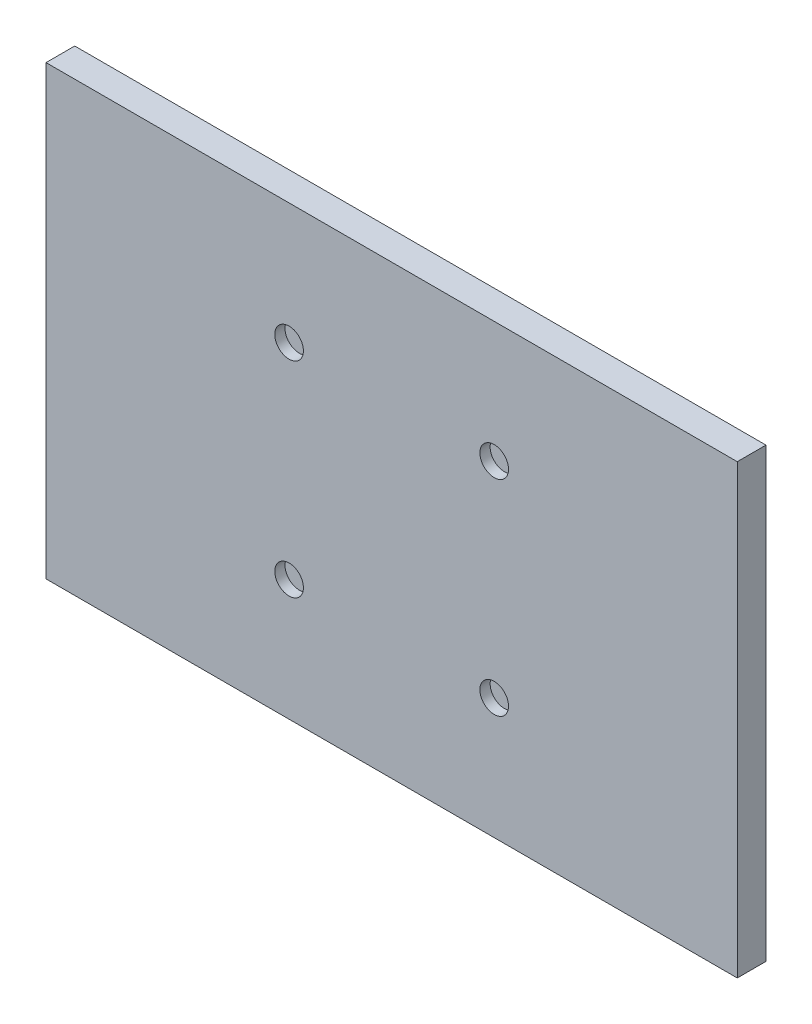
ISO-10303-21;
HEADER;
FILE_DESCRIPTION(('STEP AP214'),'2;1');
FILE_NAME('part.step','',(''),(''),'','','');
FILE_SCHEMA(('AUTOMOTIVE_DESIGN { 1 0 10303 214 1 1 1 1 }'));
ENDSEC;
DATA;
#1=APPLICATION_CONTEXT('core data for automotive mechanical design processes');
#2=APPLICATION_PROTOCOL_DEFINITION('international standard','automotive_design',2000,#1);
#3=PRODUCT_CONTEXT('',#1,'mechanical');
#4=PRODUCT('Part','Part','',(#3));
#5=PRODUCT_RELATED_PRODUCT_CATEGORY('part','',(#4));
#6=PRODUCT_DEFINITION_FORMATION('','',#4);
#7=PRODUCT_DEFINITION_CONTEXT('part definition',#1,'design');
#8=PRODUCT_DEFINITION('design','',#6,#7);
#9=PRODUCT_DEFINITION_SHAPE('','',#8);
#10=(LENGTH_UNIT() NAMED_UNIT(*) SI_UNIT(.MILLI.,.METRE.));
#11=(NAMED_UNIT(*) PLANE_ANGLE_UNIT() SI_UNIT($,.RADIAN.));
#12=(NAMED_UNIT(*) SI_UNIT($,.STERADIAN.) SOLID_ANGLE_UNIT());
#13=UNCERTAINTY_MEASURE_WITH_UNIT(LENGTH_MEASURE(1.E-05),#10,'distance_accuracy_value','');
#14=(GEOMETRIC_REPRESENTATION_CONTEXT(3) GLOBAL_UNCERTAINTY_ASSIGNED_CONTEXT((#13)) GLOBAL_UNIT_ASSIGNED_CONTEXT((#10,
#11,#12)) REPRESENTATION_CONTEXT('',''));
#15=CARTESIAN_POINT('',(0.,0.,0.));
#16=DIRECTION('',(0.,0.,1.));
#17=DIRECTION('',(1.,0.,0.));
#18=AXIS2_PLACEMENT_3D('',#15,#16,#17);
#19=CARTESIAN_POINT('',(84.25,-38.7195,7.));
#20=DIRECTION('',(0.,-1.,0.));
#21=DIRECTION('',(0.,0.,-1.));
#22=AXIS2_PLACEMENT_3D('',#19,#20,#21);
#23=PLANE('',#22);
#24=DIRECTION('',(-1.,0.,0.));
#25=VECTOR('',#24,1.);
#26=CARTESIAN_POINT('',(84.25,-38.7195,0.));
#27=LINE('',#26,#25);
#28=CARTESIAN_POINT('',(84.25,-38.7195,0.));
#29=VERTEX_POINT('',#28);
#30=CARTESIAN_POINT('',(-84.25,-38.7195,0.));
#31=VERTEX_POINT('',#30);
#32=EDGE_CURVE('E117',#29,#31,#27,.T.);
#33=ORIENTED_EDGE('',*,*,#32,.F.);
#34=DIRECTION('',(0.,0.,-1.));
#35=VECTOR('',#34,1.);
#36=CARTESIAN_POINT('',(84.25,-38.7195,7.));
#37=LINE('',#36,#35);
#38=CARTESIAN_POINT('',(84.25,-38.7195,7.));
#39=VERTEX_POINT('',#38);
#40=EDGE_CURVE('E11',#39,#29,#37,.T.);
#41=ORIENTED_EDGE('',*,*,#40,.F.);
#42=DIRECTION('',(-1.,0.,0.));
#43=VECTOR('',#42,1.);
#44=CARTESIAN_POINT('',(84.25,-38.7195,7.));
#45=LINE('',#44,#43);
#46=CARTESIAN_POINT('',(-84.25,-38.7195,7.));
#47=VERTEX_POINT('',#46);
#48=EDGE_CURVE('E109',#39,#47,#45,.T.);
#49=ORIENTED_EDGE('',*,*,#48,.T.);
#50=DIRECTION('',(0.,0.,-1.));
#51=VECTOR('',#50,1.);
#52=CARTESIAN_POINT('',(-84.25,-38.7195,7.));
#53=LINE('',#52,#51);
#54=EDGE_CURVE('E48',#47,#31,#53,.T.);
#55=ORIENTED_EDGE('',*,*,#54,.T.);
#56=EDGE_LOOP('',(#33,#41,#49,#55));
#57=FACE_BOUND('',#56,.T.);
#58=ADVANCED_FACE('F45',(#57),#23,.T.);
#59=CARTESIAN_POINT('',(84.25,-38.7195,7.));
#60=DIRECTION('',(-1.,0.,0.));
#61=DIRECTION('',(0.,-1.,0.));
#62=AXIS2_PLACEMENT_3D('',#59,#60,#61);
#63=PLANE('',#62);
#64=DIRECTION('',(0.,1.,0.));
#65=VECTOR('',#64,1.);
#66=CARTESIAN_POINT('',(84.25,-38.7195,0.));
#67=LINE('',#66,#65);
#68=CARTESIAN_POINT('',(84.25,70.2805,0.));
#69=VERTEX_POINT('',#68);
#70=EDGE_CURVE('E79',#29,#69,#67,.T.);
#71=ORIENTED_EDGE('',*,*,#70,.T.);
#72=DIRECTION('',(0.,0.,-1.));
#73=VECTOR('',#72,1.);
#74=CARTESIAN_POINT('',(84.25,70.2805,7.));
#75=LINE('',#74,#73);
#76=CARTESIAN_POINT('',(84.25,70.2805,7.));
#77=VERTEX_POINT('',#76);
#78=EDGE_CURVE('E55',#77,#69,#75,.T.);
#79=ORIENTED_EDGE('',*,*,#78,.F.);
#80=DIRECTION('',(0.,1.,0.));
#81=VECTOR('',#80,1.);
#82=CARTESIAN_POINT('',(84.25,-38.7195,7.));
#83=LINE('',#82,#81);
#84=EDGE_CURVE('E96',#39,#77,#83,.T.);
#85=ORIENTED_EDGE('',*,*,#84,.F.);
#86=ORIENTED_EDGE('',*,*,#40,.T.);
#87=EDGE_LOOP('',(#71,#79,#85,#86));
#88=FACE_BOUND('',#87,.T.);
#89=ADVANCED_FACE('F134',(#88),#63,.F.);
#90=CARTESIAN_POINT('',(84.25,70.2805,7.));
#91=DIRECTION('',(0.,-1.,0.));
#92=DIRECTION('',(0.,0.,-1.));
#93=AXIS2_PLACEMENT_3D('',#90,#91,#92);
#94=PLANE('',#93);
#95=DIRECTION('',(-1.,0.,0.));
#96=VECTOR('',#95,1.);
#97=CARTESIAN_POINT('',(84.25,70.2805,0.));
#98=LINE('',#97,#96);
#99=CARTESIAN_POINT('',(-84.25,70.2805,0.));
#100=VERTEX_POINT('',#99);
#101=EDGE_CURVE('E104',#69,#100,#98,.T.);
#102=ORIENTED_EDGE('',*,*,#101,.T.);
#103=DIRECTION('',(0.,0.,-1.));
#104=VECTOR('',#103,1.);
#105=CARTESIAN_POINT('',(-84.25,70.2805,7.));
#106=LINE('',#105,#104);
#107=CARTESIAN_POINT('',(-84.25,70.2805,7.));
#108=VERTEX_POINT('',#107);
#109=EDGE_CURVE('E101',#108,#100,#106,.T.);
#110=ORIENTED_EDGE('',*,*,#109,.F.);
#111=DIRECTION('',(-1.,0.,0.));
#112=VECTOR('',#111,1.);
#113=CARTESIAN_POINT('',(84.25,70.2805,7.));
#114=LINE('',#113,#112);
#115=EDGE_CURVE('E91',#77,#108,#114,.T.);
#116=ORIENTED_EDGE('',*,*,#115,.F.);
#117=ORIENTED_EDGE('',*,*,#78,.T.);
#118=EDGE_LOOP('',(#102,#110,#116,#117));
#119=FACE_BOUND('',#118,.T.);
#120=ADVANCED_FACE('F102',(#119),#94,.F.);
#121=CARTESIAN_POINT('',(-84.25,-38.7195,7.));
#122=DIRECTION('',(-1.,0.,0.));
#123=DIRECTION('',(0.,0.,1.));
#124=AXIS2_PLACEMENT_3D('',#121,#122,#123);
#125=PLANE('',#124);
#126=DIRECTION('',(0.,1.,0.));
#127=VECTOR('',#126,1.);
#128=CARTESIAN_POINT('',(-84.25,-38.7195,0.));
#129=LINE('',#128,#127);
#130=EDGE_CURVE('E121',#31,#100,#129,.T.);
#131=ORIENTED_EDGE('',*,*,#130,.F.);
#132=ORIENTED_EDGE('',*,*,#54,.F.);
#133=DIRECTION('',(0.,1.,0.));
#134=VECTOR('',#133,1.);
#135=CARTESIAN_POINT('',(-84.25,-38.7195,7.));
#136=LINE('',#135,#134);
#137=EDGE_CURVE('E95',#47,#108,#136,.T.);
#138=ORIENTED_EDGE('',*,*,#137,.T.);
#139=ORIENTED_EDGE('',*,*,#109,.T.);
#140=EDGE_LOOP('',(#131,#132,#138,#139));
#141=FACE_BOUND('',#140,.T.);
#142=ADVANCED_FACE('F107',(#141),#125,.T.);
#143=CARTESIAN_POINT('',(0.,0.,7.));
#144=DIRECTION('',(0.,0.,-1.));
#145=DIRECTION('',(-1.,0.,0.));
#146=AXIS2_PLACEMENT_3D('',#143,#144,#145);
#147=PLANE('',#146);
#148=CARTESIAN_POINT('',(25.0000000000005,-9.21950000000001,7.));
#149=DIRECTION('',(0.,0.,1.));
#150=DIRECTION('',(1.,0.,0.));
#151=AXIS2_PLACEMENT_3D('',#148,#149,#150);
#152=CIRCLE('',#151,3.49342964426664);
#153=CARTESIAN_POINT('',(28.4934296442672,-9.21950000000001,7.));
#154=VERTEX_POINT('',#153);
#155=EDGE_CURVE('E274',#154,#154,#152,.T.);
#156=ORIENTED_EDGE('',*,*,#155,.F.);
#157=EDGE_LOOP('',(#156));
#158=FACE_BOUND('',#157,.T.);
#159=CARTESIAN_POINT('',(-24.9999999999995,-9.21950000000035,7.));
#160=DIRECTION('',(0.,0.,1.));
#161=DIRECTION('',(1.,0.,0.));
#162=AXIS2_PLACEMENT_3D('',#159,#160,#161);
#163=CIRCLE('',#162,3.49342964426664);
#164=CARTESIAN_POINT('',(-21.5065703557328,-9.21950000000035,7.));
#165=VERTEX_POINT('',#164);
#166=EDGE_CURVE('E266',#165,#165,#163,.T.);
#167=ORIENTED_EDGE('',*,*,#166,.F.);
#168=EDGE_LOOP('',(#167));
#169=FACE_BOUND('',#168,.T.);
#170=CARTESIAN_POINT('',(-25.,40.7804999999996,7.));
#171=DIRECTION('',(0.,0.,1.));
#172=DIRECTION('',(1.,0.,0.));
#173=AXIS2_PLACEMENT_3D('',#170,#171,#172);
#174=CIRCLE('',#173,3.49342964426664);
#175=CARTESIAN_POINT('',(-21.5065703557334,40.7804999999996,7.));
#176=VERTEX_POINT('',#175);
#177=EDGE_CURVE('E257',#176,#176,#174,.T.);
#178=ORIENTED_EDGE('',*,*,#177,.F.);
#179=EDGE_LOOP('',(#178));
#180=FACE_BOUND('',#179,.T.);
#181=CARTESIAN_POINT('',(25.,40.7805,7.));
#182=DIRECTION('',(0.,0.,1.));
#183=DIRECTION('',(1.,0.,0.));
#184=AXIS2_PLACEMENT_3D('',#181,#182,#183);
#185=CIRCLE('',#184,3.49342964426664);
#186=CARTESIAN_POINT('',(28.4934296442666,40.7805,7.));
#187=VERTEX_POINT('',#186);
#188=EDGE_CURVE('E261',#187,#187,#185,.T.);
#189=ORIENTED_EDGE('',*,*,#188,.F.);
#190=EDGE_LOOP('',(#189));
#191=FACE_BOUND('',#190,.T.);
#192=ORIENTED_EDGE('',*,*,#48,.F.);
#193=ORIENTED_EDGE('',*,*,#84,.T.);
#194=ORIENTED_EDGE('',*,*,#115,.T.);
#195=ORIENTED_EDGE('',*,*,#137,.F.);
#196=EDGE_LOOP('',(#192,#193,#194,#195));
#197=FACE_BOUND('',#196,.T.);
#198=ADVANCED_FACE('F94',(#158,#169,#180,#191,#197),#147,.F.);
#199=CARTESIAN_POINT('',(0.,0.,0.));
#200=DIRECTION('',(0.,0.,-1.));
#201=DIRECTION('',(-1.,0.,0.));
#202=AXIS2_PLACEMENT_3D('',#199,#200,#201);
#203=PLANE('',#202);
#204=CARTESIAN_POINT('',(25.0000000000005,-9.21950000000001,0.));
#205=DIRECTION('',(0.,0.,1.));
#206=DIRECTION('',(1.,0.,0.));
#207=AXIS2_PLACEMENT_3D('',#204,#205,#206);
#208=CIRCLE('',#207,3.49342964426664);
#209=CARTESIAN_POINT('',(28.4934296442672,-9.21950000000001,0.));
#210=VERTEX_POINT('',#209);
#211=EDGE_CURVE('E249',#210,#210,#208,.T.);
#212=ORIENTED_EDGE('',*,*,#211,.T.);
#213=EDGE_LOOP('',(#212));
#214=FACE_BOUND('',#213,.T.);
#215=CARTESIAN_POINT('',(-24.9999999999995,-9.21950000000035,0.));
#216=DIRECTION('',(0.,0.,1.));
#217=DIRECTION('',(1.,0.,0.));
#218=AXIS2_PLACEMENT_3D('',#215,#216,#217);
#219=CIRCLE('',#218,3.49342964426664);
#220=CARTESIAN_POINT('',(-21.5065703557328,-9.21950000000035,0.));
#221=VERTEX_POINT('',#220);
#222=EDGE_CURVE('E241',#221,#221,#219,.T.);
#223=ORIENTED_EDGE('',*,*,#222,.T.);
#224=EDGE_LOOP('',(#223));
#225=FACE_BOUND('',#224,.T.);
#226=CARTESIAN_POINT('',(-25.,40.7804999999996,0.));
#227=DIRECTION('',(0.,0.,1.));
#228=DIRECTION('',(1.,0.,0.));
#229=AXIS2_PLACEMENT_3D('',#226,#227,#228);
#230=CIRCLE('',#229,3.49342964426664);
#231=CARTESIAN_POINT('',(-21.5065703557334,40.7804999999996,0.));
#232=VERTEX_POINT('',#231);
#233=EDGE_CURVE('E227',#232,#232,#230,.T.);
#234=ORIENTED_EDGE('',*,*,#233,.T.);
#235=EDGE_LOOP('',(#234));
#236=FACE_BOUND('',#235,.T.);
#237=CARTESIAN_POINT('',(25.,40.7805,0.));
#238=DIRECTION('',(0.,0.,1.));
#239=DIRECTION('',(1.,0.,0.));
#240=AXIS2_PLACEMENT_3D('',#237,#238,#239);
#241=CIRCLE('',#240,3.49342964426664);
#242=CARTESIAN_POINT('',(28.4934296442666,40.7805,0.));
#243=VERTEX_POINT('',#242);
#244=EDGE_CURVE('E226',#243,#243,#241,.T.);
#245=ORIENTED_EDGE('',*,*,#244,.T.);
#246=EDGE_LOOP('',(#245));
#247=FACE_BOUND('',#246,.T.);
#248=ORIENTED_EDGE('',*,*,#32,.T.);
#249=ORIENTED_EDGE('',*,*,#130,.T.);
#250=ORIENTED_EDGE('',*,*,#101,.F.);
#251=ORIENTED_EDGE('',*,*,#70,.F.);
#252=EDGE_LOOP('',(#248,#249,#250,#251));
#253=FACE_BOUND('',#252,.T.);
#254=ADVANCED_FACE('F131',(#214,#225,#236,#247,#253),#203,.T.);
#255=CARTESIAN_POINT('',(25.,40.7805,4.5));
#256=DIRECTION('',(0.,0.,1.));
#257=DIRECTION('',(1.,0.,0.));
#258=AXIS2_PLACEMENT_3D('',#255,#256,#257);
#259=CYLINDRICAL_SURFACE('',#258,3.49342964426664);
#260=CARTESIAN_POINT('',(25.,40.7805,4.5));
#261=DIRECTION('',(0.,0.,1.));
#262=DIRECTION('',(1.,0.,0.));
#263=AXIS2_PLACEMENT_3D('',#260,#261,#262);
#264=CIRCLE('',#263,3.49342964426664);
#265=CARTESIAN_POINT('',(28.4934296442666,40.7805,4.5));
#266=VERTEX_POINT('',#265);
#267=EDGE_CURVE('E122',#266,#266,#264,.T.);
#268=ORIENTED_EDGE('',*,*,#267,.F.);
#269=EDGE_LOOP('',(#268));
#270=FACE_BOUND('',#269,.T.);
#271=ORIENTED_EDGE('',*,*,#188,.T.);
#272=EDGE_LOOP('',(#271));
#273=FACE_BOUND('',#272,.T.);
#274=ADVANCED_FACE('F154',(#270,#273),#259,.F.);
#275=CARTESIAN_POINT('',(25.,40.7805,4.5));
#276=DIRECTION('',(0.,0.,1.));
#277=DIRECTION('',(1.,0.,0.));
#278=AXIS2_PLACEMENT_3D('',#275,#276,#277);
#279=PLANE('',#278);
#280=ORIENTED_EDGE('',*,*,#267,.T.);
#281=EDGE_LOOP('',(#280));
#282=FACE_BOUND('',#281,.T.);
#283=ADVANCED_FACE('F160',(#282),#279,.T.);
#284=CARTESIAN_POINT('',(-25.,40.7804999999996,4.5));
#285=DIRECTION('',(0.,0.,1.));
#286=DIRECTION('',(1.,0.,0.));
#287=AXIS2_PLACEMENT_3D('',#284,#285,#286);
#288=CYLINDRICAL_SURFACE('',#287,3.49342964426664);
#289=CARTESIAN_POINT('',(-25.,40.7804999999996,4.5));
#290=DIRECTION('',(0.,0.,1.));
#291=DIRECTION('',(1.,0.,0.));
#292=AXIS2_PLACEMENT_3D('',#289,#290,#291);
#293=CIRCLE('',#292,3.49342964426664);
#294=CARTESIAN_POINT('',(-21.5065703557334,40.7804999999996,4.5));
#295=VERTEX_POINT('',#294);
#296=EDGE_CURVE('E262',#295,#295,#293,.T.);
#297=ORIENTED_EDGE('',*,*,#296,.F.);
#298=EDGE_LOOP('',(#297));
#299=FACE_BOUND('',#298,.T.);
#300=ORIENTED_EDGE('',*,*,#177,.T.);
#301=EDGE_LOOP('',(#300));
#302=FACE_BOUND('',#301,.T.);
#303=ADVANCED_FACE('F164',(#299,#302),#288,.F.);
#304=CARTESIAN_POINT('',(-25.,40.7804999999996,4.5));
#305=DIRECTION('',(0.,0.,1.));
#306=DIRECTION('',(1.,0.,0.));
#307=AXIS2_PLACEMENT_3D('',#304,#305,#306);
#308=PLANE('',#307);
#309=ORIENTED_EDGE('',*,*,#296,.T.);
#310=EDGE_LOOP('',(#309));
#311=FACE_BOUND('',#310,.T.);
#312=ADVANCED_FACE('F182',(#311),#308,.T.);
#313=CARTESIAN_POINT('',(-24.9999999999995,-9.21950000000035,4.5));
#314=DIRECTION('',(0.,0.,1.));
#315=DIRECTION('',(1.,0.,0.));
#316=AXIS2_PLACEMENT_3D('',#313,#314,#315);
#317=CYLINDRICAL_SURFACE('',#316,3.49342964426664);
#318=CARTESIAN_POINT('',(-24.9999999999995,-9.21950000000035,4.5));
#319=DIRECTION('',(0.,0.,1.));
#320=DIRECTION('',(1.,0.,0.));
#321=AXIS2_PLACEMENT_3D('',#318,#319,#320);
#322=CIRCLE('',#321,3.49342964426664);
#323=CARTESIAN_POINT('',(-21.5065703557328,-9.21950000000035,4.5));
#324=VERTEX_POINT('',#323);
#325=EDGE_CURVE('E270',#324,#324,#322,.T.);
#326=ORIENTED_EDGE('',*,*,#325,.F.);
#327=EDGE_LOOP('',(#326));
#328=FACE_BOUND('',#327,.T.);
#329=ORIENTED_EDGE('',*,*,#166,.T.);
#330=EDGE_LOOP('',(#329));
#331=FACE_BOUND('',#330,.T.);
#332=ADVANCED_FACE('F178',(#328,#331),#317,.F.);
#333=CARTESIAN_POINT('',(-24.9999999999995,-9.21950000000035,4.5));
#334=DIRECTION('',(0.,0.,1.));
#335=DIRECTION('',(1.,0.,0.));
#336=AXIS2_PLACEMENT_3D('',#333,#334,#335);
#337=PLANE('',#336);
#338=ORIENTED_EDGE('',*,*,#325,.T.);
#339=EDGE_LOOP('',(#338));
#340=FACE_BOUND('',#339,.T.);
#341=ADVANCED_FACE('F174',(#340),#337,.T.);
#342=CARTESIAN_POINT('',(25.0000000000005,-9.21950000000001,4.5));
#343=DIRECTION('',(0.,0.,1.));
#344=DIRECTION('',(1.,0.,0.));
#345=AXIS2_PLACEMENT_3D('',#342,#343,#344);
#346=CYLINDRICAL_SURFACE('',#345,3.49342964426664);
#347=CARTESIAN_POINT('',(25.0000000000005,-9.21950000000001,4.5));
#348=DIRECTION('',(0.,0.,1.));
#349=DIRECTION('',(1.,0.,0.));
#350=AXIS2_PLACEMENT_3D('',#347,#348,#349);
#351=CIRCLE('',#350,3.49342964426664);
#352=CARTESIAN_POINT('',(28.4934296442672,-9.21950000000001,4.5));
#353=VERTEX_POINT('',#352);
#354=EDGE_CURVE('E255',#353,#353,#351,.T.);
#355=ORIENTED_EDGE('',*,*,#354,.F.);
#356=EDGE_LOOP('',(#355));
#357=FACE_BOUND('',#356,.T.);
#358=ORIENTED_EDGE('',*,*,#155,.T.);
#359=EDGE_LOOP('',(#358));
#360=FACE_BOUND('',#359,.T.);
#361=ADVANCED_FACE('F170',(#357,#360),#346,.F.);
#362=CARTESIAN_POINT('',(25.0000000000005,-9.21950000000001,4.5));
#363=DIRECTION('',(0.,0.,1.));
#364=DIRECTION('',(1.,0.,0.));
#365=AXIS2_PLACEMENT_3D('',#362,#363,#364);
#366=PLANE('',#365);
#367=ORIENTED_EDGE('',*,*,#354,.T.);
#368=EDGE_LOOP('',(#367));
#369=FACE_BOUND('',#368,.T.);
#370=ADVANCED_FACE('F166',(#369),#366,.T.);
#371=CARTESIAN_POINT('',(25.,40.7805,2.5));
#372=DIRECTION('',(0.,0.,-1.));
#373=DIRECTION('',(-1.,0.,0.));
#374=AXIS2_PLACEMENT_3D('',#371,#372,#373);
#375=CYLINDRICAL_SURFACE('',#374,3.49342964426664);
#376=CARTESIAN_POINT('',(25.,40.7805,2.5));
#377=DIRECTION('',(0.,0.,1.));
#378=DIRECTION('',(1.,0.,0.));
#379=AXIS2_PLACEMENT_3D('',#376,#377,#378);
#380=CIRCLE('',#379,3.49342964426664);
#381=CARTESIAN_POINT('',(28.4934296442666,40.7805,2.5));
#382=VERTEX_POINT('',#381);
#383=EDGE_CURVE('E232',#382,#382,#380,.T.);
#384=ORIENTED_EDGE('',*,*,#383,.T.);
#385=EDGE_LOOP('',(#384));
#386=FACE_BOUND('',#385,.T.);
#387=ORIENTED_EDGE('',*,*,#244,.F.);
#388=EDGE_LOOP('',(#387));
#389=FACE_BOUND('',#388,.T.);
#390=ADVANCED_FACE('F169',(#386,#389),#375,.F.);
#391=CARTESIAN_POINT('',(25.,40.7805,2.5));
#392=DIRECTION('',(0.,0.,-1.));
#393=DIRECTION('',(1.,0.,0.));
#394=AXIS2_PLACEMENT_3D('',#391,#392,#393);
#395=PLANE('',#394);
#396=ORIENTED_EDGE('',*,*,#383,.F.);
#397=EDGE_LOOP('',(#396));
#398=FACE_BOUND('',#397,.T.);
#399=ADVANCED_FACE('F192',(#398),#395,.T.);
#400=CARTESIAN_POINT('',(-25.,40.7804999999996,2.5));
#401=DIRECTION('',(0.,0.,-1.));
#402=DIRECTION('',(-1.,0.,0.));
#403=AXIS2_PLACEMENT_3D('',#400,#401,#402);
#404=CYLINDRICAL_SURFACE('',#403,3.49342964426664);
#405=CARTESIAN_POINT('',(-25.,40.7804999999996,2.5));
#406=DIRECTION('',(0.,0.,1.));
#407=DIRECTION('',(1.,0.,0.));
#408=AXIS2_PLACEMENT_3D('',#405,#406,#407);
#409=CIRCLE('',#408,3.49342964426664);
#410=CARTESIAN_POINT('',(-21.5065703557334,40.7804999999996,2.5));
#411=VERTEX_POINT('',#410);
#412=EDGE_CURVE('E224',#411,#411,#409,.T.);
#413=ORIENTED_EDGE('',*,*,#412,.T.);
#414=EDGE_LOOP('',(#413));
#415=FACE_BOUND('',#414,.T.);
#416=ORIENTED_EDGE('',*,*,#233,.F.);
#417=EDGE_LOOP('',(#416));
#418=FACE_BOUND('',#417,.T.);
#419=ADVANCED_FACE('F196',(#415,#418),#404,.F.);
#420=CARTESIAN_POINT('',(-25.,40.7804999999996,2.5));
#421=DIRECTION('',(0.,0.,-1.));
#422=DIRECTION('',(1.,0.,0.));
#423=AXIS2_PLACEMENT_3D('',#420,#421,#422);
#424=PLANE('',#423);
#425=ORIENTED_EDGE('',*,*,#412,.F.);
#426=EDGE_LOOP('',(#425));
#427=FACE_BOUND('',#426,.T.);
#428=ADVANCED_FACE('F210',(#427),#424,.T.);
#429=CARTESIAN_POINT('',(-24.9999999999995,-9.21950000000035,2.5));
#430=DIRECTION('',(0.,0.,-1.));
#431=DIRECTION('',(-1.,0.,0.));
#432=AXIS2_PLACEMENT_3D('',#429,#430,#431);
#433=CYLINDRICAL_SURFACE('',#432,3.49342964426664);
#434=CARTESIAN_POINT('',(-24.9999999999995,-9.21950000000035,2.5));
#435=DIRECTION('',(0.,0.,1.));
#436=DIRECTION('',(1.,0.,0.));
#437=AXIS2_PLACEMENT_3D('',#434,#435,#436);
#438=CIRCLE('',#437,3.49342964426664);
#439=CARTESIAN_POINT('',(-21.5065703557328,-9.21950000000035,2.5));
#440=VERTEX_POINT('',#439);
#441=EDGE_CURVE('E235',#440,#440,#438,.T.);
#442=ORIENTED_EDGE('',*,*,#441,.T.);
#443=EDGE_LOOP('',(#442));
#444=FACE_BOUND('',#443,.T.);
#445=ORIENTED_EDGE('',*,*,#222,.F.);
#446=EDGE_LOOP('',(#445));
#447=FACE_BOUND('',#446,.T.);
#448=ADVANCED_FACE('F207',(#444,#447),#433,.F.);
#449=CARTESIAN_POINT('',(-24.9999999999995,-9.21950000000035,2.5));
#450=DIRECTION('',(0.,0.,-1.));
#451=DIRECTION('',(1.,0.,0.));
#452=AXIS2_PLACEMENT_3D('',#449,#450,#451);
#453=PLANE('',#452);
#454=ORIENTED_EDGE('',*,*,#441,.F.);
#455=EDGE_LOOP('',(#454));
#456=FACE_BOUND('',#455,.T.);
#457=ADVANCED_FACE('F202',(#456),#453,.T.);
#458=CARTESIAN_POINT('',(25.0000000000005,-9.21950000000001,2.5));
#459=DIRECTION('',(0.,0.,-1.));
#460=DIRECTION('',(-1.,0.,0.));
#461=AXIS2_PLACEMENT_3D('',#458,#459,#460);
#462=CYLINDRICAL_SURFACE('',#461,3.49342964426664);
#463=CARTESIAN_POINT('',(25.0000000000005,-9.21950000000001,2.5));
#464=DIRECTION('',(0.,0.,1.));
#465=DIRECTION('',(1.,0.,0.));
#466=AXIS2_PLACEMENT_3D('',#463,#464,#465);
#467=CIRCLE('',#466,3.49342964426664);
#468=CARTESIAN_POINT('',(28.4934296442672,-9.21950000000001,2.5));
#469=VERTEX_POINT('',#468);
#470=EDGE_CURVE('E245',#469,#469,#467,.T.);
#471=ORIENTED_EDGE('',*,*,#470,.T.);
#472=EDGE_LOOP('',(#471));
#473=FACE_BOUND('',#472,.T.);
#474=ORIENTED_EDGE('',*,*,#211,.F.);
#475=EDGE_LOOP('',(#474));
#476=FACE_BOUND('',#475,.T.);
#477=ADVANCED_FACE('F198',(#473,#476),#462,.F.);
#478=CARTESIAN_POINT('',(25.0000000000005,-9.21950000000001,2.5));
#479=DIRECTION('',(0.,0.,-1.));
#480=DIRECTION('',(1.,0.,0.));
#481=AXIS2_PLACEMENT_3D('',#478,#479,#480);
#482=PLANE('',#481);
#483=ORIENTED_EDGE('',*,*,#470,.F.);
#484=EDGE_LOOP('',(#483));
#485=FACE_BOUND('',#484,.T.);
#486=ADVANCED_FACE('F201',(#485),#482,.T.);
#487=CLOSED_SHELL('',(#58,#89,#120,#142,#198,#254,#274,#283,#303,#312,#332,#341,#361,#370,#390,
#399,#419,#428,#448,#457,#477,#486));
#488=MANIFOLD_SOLID_BREP('B2',#487);
#489=ADVANCED_BREP_SHAPE_REPRESENTATION('',(#18,#488),#14);
#490=SHAPE_DEFINITION_REPRESENTATION(#9,#489);
ENDSEC;
END-ISO-10303-21;
